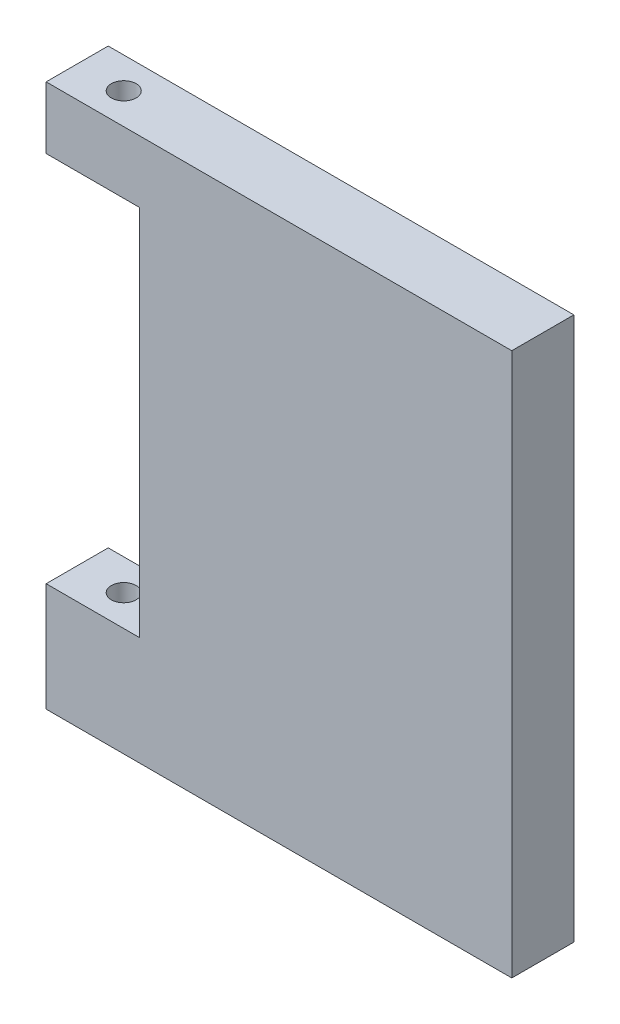
ISO-10303-21;
HEADER;
FILE_DESCRIPTION(('STEP AP214'),'2;1');
FILE_NAME('part.step','',(''),(''),'','','');
FILE_SCHEMA(('AUTOMOTIVE_DESIGN { 1 0 10303 214 1 1 1 1 }'));
ENDSEC;
DATA;
#1=APPLICATION_CONTEXT('core data for automotive mechanical design processes');
#2=APPLICATION_PROTOCOL_DEFINITION('international standard','automotive_design',2000,#1);
#3=PRODUCT_CONTEXT('',#1,'mechanical');
#4=PRODUCT('Part','Part','',(#3));
#5=PRODUCT_RELATED_PRODUCT_CATEGORY('part','',(#4));
#6=PRODUCT_DEFINITION_FORMATION('','',#4);
#7=PRODUCT_DEFINITION_CONTEXT('part definition',#1,'design');
#8=PRODUCT_DEFINITION('design','',#6,#7);
#9=PRODUCT_DEFINITION_SHAPE('','',#8);
#10=(LENGTH_UNIT() NAMED_UNIT(*) SI_UNIT(.MILLI.,.METRE.));
#11=(NAMED_UNIT(*) PLANE_ANGLE_UNIT() SI_UNIT($,.RADIAN.));
#12=(NAMED_UNIT(*) SI_UNIT($,.STERADIAN.) SOLID_ANGLE_UNIT());
#13=UNCERTAINTY_MEASURE_WITH_UNIT(LENGTH_MEASURE(1.E-05),#10,'distance_accuracy_value','');
#14=(GEOMETRIC_REPRESENTATION_CONTEXT(3) GLOBAL_UNCERTAINTY_ASSIGNED_CONTEXT((#13)) GLOBAL_UNIT_ASSIGNED_CONTEXT((#10,
#11,#12)) REPRESENTATION_CONTEXT('',''));
#15=CARTESIAN_POINT('',(0.,0.,0.));
#16=DIRECTION('',(0.,0.,1.));
#17=DIRECTION('',(1.,0.,0.));
#18=AXIS2_PLACEMENT_3D('',#15,#16,#17);
#19=CARTESIAN_POINT('',(0.,0.,40.));
#20=DIRECTION('',(-1.,0.,0.));
#21=DIRECTION('',(0.,0.,1.));
#22=AXIS2_PLACEMENT_3D('',#19,#20,#21);
#23=PLANE('',#22);
#24=DIRECTION('',(0.,1.,0.));
#25=VECTOR('',#24,1.);
#26=CARTESIAN_POINT('',(0.,0.,0.));
#27=LINE('',#26,#25);
#28=CARTESIAN_POINT('',(0.,0.,0.));
#29=VERTEX_POINT('',#28);
#30=CARTESIAN_POINT('',(0.,350.,0.));
#31=VERTEX_POINT('',#30);
#32=EDGE_CURVE('E132',#29,#31,#27,.T.);
#33=ORIENTED_EDGE('',*,*,#32,.T.);
#34=DIRECTION('',(0.,0.,-1.));
#35=VECTOR('',#34,1.);
#36=CARTESIAN_POINT('',(0.,350.,40.));
#37=LINE('',#36,#35);
#38=CARTESIAN_POINT('',(0.,350.,40.));
#39=VERTEX_POINT('',#38);
#40=EDGE_CURVE('E11',#39,#31,#37,.T.);
#41=ORIENTED_EDGE('',*,*,#40,.F.);
#42=DIRECTION('',(0.,1.,0.));
#43=VECTOR('',#42,1.);
#44=CARTESIAN_POINT('',(0.,0.,40.));
#45=LINE('',#44,#43);
#46=CARTESIAN_POINT('',(0.,0.,40.));
#47=VERTEX_POINT('',#46);
#48=EDGE_CURVE('E147',#47,#39,#45,.T.);
#49=ORIENTED_EDGE('',*,*,#48,.F.);
#50=DIRECTION('',(0.,0.,-1.));
#51=VECTOR('',#50,1.);
#52=CARTESIAN_POINT('',(0.,0.,40.));
#53=LINE('',#52,#51);
#54=EDGE_CURVE('E128',#47,#29,#53,.T.);
#55=ORIENTED_EDGE('',*,*,#54,.T.);
#56=EDGE_LOOP('',(#33,#41,#49,#55));
#57=FACE_BOUND('',#56,.T.);
#58=ADVANCED_FACE('F35',(#57),#23,.F.);
#59=CARTESIAN_POINT('',(0.,350.,40.));
#60=DIRECTION('',(0.,-1.,0.));
#61=DIRECTION('',(1.,0.,0.));
#62=AXIS2_PLACEMENT_3D('',#59,#60,#61);
#63=PLANE('',#62);
#64=CARTESIAN_POINT('',(-270.,350.,20.));
#65=DIRECTION('',(0.,1.,0.));
#66=DIRECTION('',(-1.,0.,0.));
#67=AXIS2_PLACEMENT_3D('',#64,#65,#66);
#68=CIRCLE('',#67,7.99999999999998);
#69=CARTESIAN_POINT('',(-278.,350.,20.));
#70=VERTEX_POINT('',#69);
#71=EDGE_CURVE('E183',#70,#70,#68,.T.);
#72=ORIENTED_EDGE('',*,*,#71,.F.);
#73=EDGE_LOOP('',(#72));
#74=FACE_BOUND('',#73,.T.);
#75=DIRECTION('',(-1.,0.,0.));
#76=VECTOR('',#75,1.);
#77=CARTESIAN_POINT('',(0.,350.,0.));
#78=LINE('',#77,#76);
#79=CARTESIAN_POINT('',(-300.,350.,0.));
#80=VERTEX_POINT('',#79);
#81=EDGE_CURVE('E135',#31,#80,#78,.T.);
#82=ORIENTED_EDGE('',*,*,#81,.T.);
#83=DIRECTION('',(0.,0.,-1.));
#84=VECTOR('',#83,1.);
#85=CARTESIAN_POINT('',(-300.,350.,40.));
#86=LINE('',#85,#84);
#87=CARTESIAN_POINT('',(-300.,350.,40.));
#88=VERTEX_POINT('',#87);
#89=EDGE_CURVE('E44',#88,#80,#86,.T.);
#90=ORIENTED_EDGE('',*,*,#89,.F.);
#91=DIRECTION('',(-1.,0.,0.));
#92=VECTOR('',#91,1.);
#93=CARTESIAN_POINT('',(0.,350.,40.));
#94=LINE('',#93,#92);
#95=EDGE_CURVE('E95',#39,#88,#94,.T.);
#96=ORIENTED_EDGE('',*,*,#95,.F.);
#97=ORIENTED_EDGE('',*,*,#40,.T.);
#98=EDGE_LOOP('',(#82,#90,#96,#97));
#99=FACE_BOUND('',#98,.T.);
#100=ADVANCED_FACE('F244',(#74,#99),#63,.F.);
#101=CARTESIAN_POINT('',(-300.,310.,40.));
#102=DIRECTION('',(1.,0.,0.));
#103=DIRECTION('',(0.,0.,-1.));
#104=AXIS2_PLACEMENT_3D('',#101,#102,#103);
#105=PLANE('',#104);
#106=DIRECTION('',(0.,-1.,0.));
#107=VECTOR('',#106,1.);
#108=CARTESIAN_POINT('',(-300.,310.,0.));
#109=LINE('',#108,#107);
#110=CARTESIAN_POINT('',(-300.,310.,0.));
#111=VERTEX_POINT('',#110);
#112=EDGE_CURVE('E138',#80,#111,#109,.T.);
#113=ORIENTED_EDGE('',*,*,#112,.T.);
#114=DIRECTION('',(0.,0.,-1.));
#115=VECTOR('',#114,1.);
#116=CARTESIAN_POINT('',(-300.,310.,40.));
#117=LINE('',#116,#115);
#118=CARTESIAN_POINT('',(-300.,310.,40.));
#119=VERTEX_POINT('',#118);
#120=EDGE_CURVE('E154',#119,#111,#117,.T.);
#121=ORIENTED_EDGE('',*,*,#120,.F.);
#122=DIRECTION('',(0.,-1.,0.));
#123=VECTOR('',#122,1.);
#124=CARTESIAN_POINT('',(-300.,310.,40.));
#125=LINE('',#124,#123);
#126=EDGE_CURVE('E163',#88,#119,#125,.T.);
#127=ORIENTED_EDGE('',*,*,#126,.F.);
#128=ORIENTED_EDGE('',*,*,#89,.T.);
#129=EDGE_LOOP('',(#113,#121,#127,#128));
#130=FACE_BOUND('',#129,.T.);
#131=ADVANCED_FACE('F161',(#130),#105,.F.);
#132=CARTESIAN_POINT('',(-300.,310.,40.));
#133=DIRECTION('',(0.,1.,0.));
#134=DIRECTION('',(-1.,0.,0.));
#135=AXIS2_PLACEMENT_3D('',#132,#133,#134);
#136=PLANE('',#135);
#137=CARTESIAN_POINT('',(-270.,310.,20.));
#138=DIRECTION('',(0.,1.,0.));
#139=DIRECTION('',(-1.,0.,0.));
#140=AXIS2_PLACEMENT_3D('',#137,#138,#139);
#141=CIRCLE('',#140,7.99999999999998);
#142=CARTESIAN_POINT('',(-278.,310.,20.));
#143=VERTEX_POINT('',#142);
#144=EDGE_CURVE('E136',#143,#143,#141,.T.);
#145=ORIENTED_EDGE('',*,*,#144,.T.);
#146=EDGE_LOOP('',(#145));
#147=FACE_BOUND('',#146,.T.);
#148=DIRECTION('',(1.,0.,0.));
#149=VECTOR('',#148,1.);
#150=CARTESIAN_POINT('',(-300.,310.,0.));
#151=LINE('',#150,#149);
#152=CARTESIAN_POINT('',(-240.,310.,0.));
#153=VERTEX_POINT('',#152);
#154=EDGE_CURVE('E140',#111,#153,#151,.T.);
#155=ORIENTED_EDGE('',*,*,#154,.T.);
#156=DIRECTION('',(0.,0.,-1.));
#157=VECTOR('',#156,1.);
#158=CARTESIAN_POINT('',(-240.,310.,40.));
#159=LINE('',#158,#157);
#160=CARTESIAN_POINT('',(-240.,310.,40.));
#161=VERTEX_POINT('',#160);
#162=EDGE_CURVE('E151',#161,#153,#159,.T.);
#163=ORIENTED_EDGE('',*,*,#162,.F.);
#164=DIRECTION('',(1.,0.,0.));
#165=VECTOR('',#164,1.);
#166=CARTESIAN_POINT('',(-300.,310.,40.));
#167=LINE('',#166,#165);
#168=EDGE_CURVE('E175',#119,#161,#167,.T.);
#169=ORIENTED_EDGE('',*,*,#168,.F.);
#170=ORIENTED_EDGE('',*,*,#120,.T.);
#171=EDGE_LOOP('',(#155,#163,#169,#170));
#172=FACE_BOUND('',#171,.T.);
#173=ADVANCED_FACE('F171',(#147,#172),#136,.F.);
#174=CARTESIAN_POINT('',(-240.,310.,40.));
#175=DIRECTION('',(1.,0.,0.));
#176=DIRECTION('',(0.,1.,0.));
#177=AXIS2_PLACEMENT_3D('',#174,#175,#176);
#178=PLANE('',#177);
#179=DIRECTION('',(0.,-1.,0.));
#180=VECTOR('',#179,1.);
#181=CARTESIAN_POINT('',(-240.,310.,0.));
#182=LINE('',#181,#180);
#183=CARTESIAN_POINT('',(-240.,70.,0.));
#184=VERTEX_POINT('',#183);
#185=EDGE_CURVE('E142',#153,#184,#182,.T.);
#186=ORIENTED_EDGE('',*,*,#185,.T.);
#187=DIRECTION('',(0.,0.,-1.));
#188=VECTOR('',#187,1.);
#189=CARTESIAN_POINT('',(-240.,70.,40.));
#190=LINE('',#189,#188);
#191=CARTESIAN_POINT('',(-240.,70.,40.));
#192=VERTEX_POINT('',#191);
#193=EDGE_CURVE('E123',#192,#184,#190,.T.);
#194=ORIENTED_EDGE('',*,*,#193,.F.);
#195=DIRECTION('',(0.,-1.,0.));
#196=VECTOR('',#195,1.);
#197=CARTESIAN_POINT('',(-240.,310.,40.));
#198=LINE('',#197,#196);
#199=EDGE_CURVE('E114',#161,#192,#198,.T.);
#200=ORIENTED_EDGE('',*,*,#199,.F.);
#201=ORIENTED_EDGE('',*,*,#162,.T.);
#202=EDGE_LOOP('',(#186,#194,#200,#201));
#203=FACE_BOUND('',#202,.T.);
#204=ADVANCED_FACE('F174',(#203),#178,.F.);
#205=CARTESIAN_POINT('',(-300.,70.,40.));
#206=DIRECTION('',(0.,-1.,0.));
#207=DIRECTION('',(0.,0.,-1.));
#208=AXIS2_PLACEMENT_3D('',#205,#206,#207);
#209=PLANE('',#208);
#210=CARTESIAN_POINT('',(-270.,70.,20.));
#211=DIRECTION('',(0.,-1.,0.));
#212=DIRECTION('',(0.,0.,-1.));
#213=AXIS2_PLACEMENT_3D('',#210,#211,#212);
#214=CIRCLE('',#213,7.99999999999998);
#215=CARTESIAN_POINT('',(-270.,70.,12.));
#216=VERTEX_POINT('',#215);
#217=EDGE_CURVE('E38',#216,#216,#214,.T.);
#218=ORIENTED_EDGE('',*,*,#217,.T.);
#219=EDGE_LOOP('',(#218));
#220=FACE_BOUND('',#219,.T.);
#221=DIRECTION('',(-1.,0.,0.));
#222=VECTOR('',#221,1.);
#223=CARTESIAN_POINT('',(-300.,70.,0.));
#224=LINE('',#223,#222);
#225=CARTESIAN_POINT('',(-300.,70.,0.));
#226=VERTEX_POINT('',#225);
#227=EDGE_CURVE('E122',#184,#226,#224,.T.);
#228=ORIENTED_EDGE('',*,*,#227,.T.);
#229=DIRECTION('',(0.,0.,-1.));
#230=VECTOR('',#229,1.);
#231=CARTESIAN_POINT('',(-300.,70.,40.));
#232=LINE('',#231,#230);
#233=CARTESIAN_POINT('',(-300.,70.,40.));
#234=VERTEX_POINT('',#233);
#235=EDGE_CURVE('E119',#234,#226,#232,.T.);
#236=ORIENTED_EDGE('',*,*,#235,.F.);
#237=DIRECTION('',(-1.,0.,0.));
#238=VECTOR('',#237,1.);
#239=CARTESIAN_POINT('',(-300.,70.,40.));
#240=LINE('',#239,#238);
#241=EDGE_CURVE('E108',#192,#234,#240,.T.);
#242=ORIENTED_EDGE('',*,*,#241,.F.);
#243=ORIENTED_EDGE('',*,*,#193,.T.);
#244=EDGE_LOOP('',(#228,#236,#242,#243));
#245=FACE_BOUND('',#244,.T.);
#246=ADVANCED_FACE('F120',(#220,#245),#209,.F.);
#247=CARTESIAN_POINT('',(-300.,0.,40.));
#248=DIRECTION('',(1.,0.,0.));
#249=DIRECTION('',(0.,0.,-1.));
#250=AXIS2_PLACEMENT_3D('',#247,#248,#249);
#251=PLANE('',#250);
#252=DIRECTION('',(0.,-1.,0.));
#253=VECTOR('',#252,1.);
#254=CARTESIAN_POINT('',(-300.,0.,0.));
#255=LINE('',#254,#253);
#256=CARTESIAN_POINT('',(-300.,0.,0.));
#257=VERTEX_POINT('',#256);
#258=EDGE_CURVE('E81',#226,#257,#255,.T.);
#259=ORIENTED_EDGE('',*,*,#258,.T.);
#260=DIRECTION('',(0.,0.,-1.));
#261=VECTOR('',#260,1.);
#262=CARTESIAN_POINT('',(-300.,0.,40.));
#263=LINE('',#262,#261);
#264=CARTESIAN_POINT('',(-300.,0.,40.));
#265=VERTEX_POINT('',#264);
#266=EDGE_CURVE('E124',#265,#257,#263,.T.);
#267=ORIENTED_EDGE('',*,*,#266,.F.);
#268=DIRECTION('',(0.,-1.,0.));
#269=VECTOR('',#268,1.);
#270=CARTESIAN_POINT('',(-300.,0.,40.));
#271=LINE('',#270,#269);
#272=EDGE_CURVE('E112',#234,#265,#271,.T.);
#273=ORIENTED_EDGE('',*,*,#272,.F.);
#274=ORIENTED_EDGE('',*,*,#235,.T.);
#275=EDGE_LOOP('',(#259,#267,#273,#274));
#276=FACE_BOUND('',#275,.T.);
#277=ADVANCED_FACE('F126',(#276),#251,.F.);
#278=CARTESIAN_POINT('',(0.,0.,40.));
#279=DIRECTION('',(0.,1.,0.));
#280=DIRECTION('',(0.,0.,1.));
#281=AXIS2_PLACEMENT_3D('',#278,#279,#280);
#282=PLANE('',#281);
#283=CARTESIAN_POINT('',(-210.,0.,20.));
#284=DIRECTION('',(0.,-1.,0.));
#285=DIRECTION('',(0.,0.,-1.));
#286=AXIS2_PLACEMENT_3D('',#283,#284,#285);
#287=CIRCLE('',#286,3.99999999999999);
#288=CARTESIAN_POINT('',(-210.,0.,16.));
#289=VERTEX_POINT('',#288);
#290=EDGE_CURVE('E202',#289,#289,#287,.T.);
#291=ORIENTED_EDGE('',*,*,#290,.F.);
#292=EDGE_LOOP('',(#291));
#293=FACE_BOUND('',#292,.T.);
#294=CARTESIAN_POINT('',(-120.,0.,20.));
#295=DIRECTION('',(0.,-1.,0.));
#296=DIRECTION('',(0.,0.,-1.));
#297=AXIS2_PLACEMENT_3D('',#294,#295,#296);
#298=CIRCLE('',#297,4.00000000000001);
#299=CARTESIAN_POINT('',(-120.,0.,16.));
#300=VERTEX_POINT('',#299);
#301=EDGE_CURVE('E196',#300,#300,#298,.T.);
#302=ORIENTED_EDGE('',*,*,#301,.F.);
#303=EDGE_LOOP('',(#302));
#304=FACE_BOUND('',#303,.T.);
#305=CARTESIAN_POINT('',(-30.,0.,20.));
#306=DIRECTION('',(0.,-1.,0.));
#307=DIRECTION('',(0.,0.,-1.));
#308=AXIS2_PLACEMENT_3D('',#305,#306,#307);
#309=CIRCLE('',#308,4.00000000000001);
#310=CARTESIAN_POINT('',(-30.,0.,16.));
#311=VERTEX_POINT('',#310);
#312=EDGE_CURVE('E190',#311,#311,#309,.T.);
#313=ORIENTED_EDGE('',*,*,#312,.F.);
#314=EDGE_LOOP('',(#313));
#315=FACE_BOUND('',#314,.T.);
#316=DIRECTION('',(1.,0.,0.));
#317=VECTOR('',#316,1.);
#318=CARTESIAN_POINT('',(0.,0.,0.));
#319=LINE('',#318,#317);
#320=EDGE_CURVE('E87',#257,#29,#319,.T.);
#321=ORIENTED_EDGE('',*,*,#320,.T.);
#322=ORIENTED_EDGE('',*,*,#54,.F.);
#323=DIRECTION('',(1.,0.,0.));
#324=VECTOR('',#323,1.);
#325=CARTESIAN_POINT('',(0.,0.,40.));
#326=LINE('',#325,#324);
#327=EDGE_CURVE('E52',#265,#47,#326,.T.);
#328=ORIENTED_EDGE('',*,*,#327,.F.);
#329=ORIENTED_EDGE('',*,*,#266,.T.);
#330=EDGE_LOOP('',(#321,#322,#328,#329));
#331=FACE_BOUND('',#330,.T.);
#332=ADVANCED_FACE('F217',(#293,#304,#315,#331),#282,.F.);
#333=CARTESIAN_POINT('',(0.,0.,40.));
#334=DIRECTION('',(0.,0.,1.));
#335=DIRECTION('',(1.,0.,0.));
#336=AXIS2_PLACEMENT_3D('',#333,#334,#335);
#337=PLANE('',#336);
#338=ORIENTED_EDGE('',*,*,#48,.T.);
#339=ORIENTED_EDGE('',*,*,#95,.T.);
#340=ORIENTED_EDGE('',*,*,#126,.T.);
#341=ORIENTED_EDGE('',*,*,#168,.T.);
#342=ORIENTED_EDGE('',*,*,#199,.T.);
#343=ORIENTED_EDGE('',*,*,#241,.T.);
#344=ORIENTED_EDGE('',*,*,#272,.T.);
#345=ORIENTED_EDGE('',*,*,#327,.T.);
#346=EDGE_LOOP('',(#338,#339,#340,#341,#342,#343,#344,#345));
#347=FACE_BOUND('',#346,.T.);
#348=ADVANCED_FACE('F110',(#347),#337,.T.);
#349=CARTESIAN_POINT('',(0.,0.,0.));
#350=DIRECTION('',(0.,0.,1.));
#351=DIRECTION('',(1.,0.,0.));
#352=AXIS2_PLACEMENT_3D('',#349,#350,#351);
#353=PLANE('',#352);
#354=ORIENTED_EDGE('',*,*,#32,.F.);
#355=ORIENTED_EDGE('',*,*,#320,.F.);
#356=ORIENTED_EDGE('',*,*,#258,.F.);
#357=ORIENTED_EDGE('',*,*,#227,.F.);
#358=ORIENTED_EDGE('',*,*,#185,.F.);
#359=ORIENTED_EDGE('',*,*,#154,.F.);
#360=ORIENTED_EDGE('',*,*,#112,.F.);
#361=ORIENTED_EDGE('',*,*,#81,.F.);
#362=EDGE_LOOP('',(#354,#355,#356,#357,#358,#359,#360,#361));
#363=FACE_BOUND('',#362,.T.);
#364=ADVANCED_FACE('F167',(#363),#353,.F.);
#365=CARTESIAN_POINT('',(-270.,49.9999999999998,20.));
#366=DIRECTION('',(0.,1.,0.));
#367=DIRECTION('',(-1.,0.,0.));
#368=AXIS2_PLACEMENT_3D('',#365,#366,#367);
#369=PLANE('',#368);
#370=CARTESIAN_POINT('',(-270.,49.9999999999998,20.));
#371=DIRECTION('',(0.,1.,0.));
#372=DIRECTION('',(-1.,0.,0.));
#373=AXIS2_PLACEMENT_3D('',#370,#371,#372);
#374=CIRCLE('',#373,7.99999999999998);
#375=CARTESIAN_POINT('',(-278.,49.9999999999998,20.));
#376=VERTEX_POINT('',#375);
#377=EDGE_CURVE('E186',#376,#376,#374,.T.);
#378=ORIENTED_EDGE('',*,*,#377,.T.);
#379=EDGE_LOOP('',(#378));
#380=FACE_BOUND('',#379,.T.);
#381=ADVANCED_FACE('F270',(#380),#369,.T.);
#382=CARTESIAN_POINT('',(-270.,49.9999999999998,20.));
#383=DIRECTION('',(0.,1.,0.));
#384=DIRECTION('',(-1.,0.,0.));
#385=AXIS2_PLACEMENT_3D('',#382,#383,#384);
#386=CYLINDRICAL_SURFACE('',#385,7.99999999999998);
#387=ORIENTED_EDGE('',*,*,#377,.F.);
#388=EDGE_LOOP('',(#387));
#389=FACE_BOUND('',#388,.T.);
#390=ORIENTED_EDGE('',*,*,#217,.F.);
#391=EDGE_LOOP('',(#390));
#392=FACE_BOUND('',#391,.T.);
#393=ADVANCED_FACE('F238',(#389,#392),#386,.F.);
#394=ORIENTED_EDGE('',*,*,#71,.T.);
#395=EDGE_LOOP('',(#394));
#396=FACE_BOUND('',#395,.T.);
#397=ORIENTED_EDGE('',*,*,#144,.F.);
#398=EDGE_LOOP('',(#397));
#399=FACE_BOUND('',#398,.T.);
#400=ADVANCED_FACE('F228',(#396,#399),#386,.F.);
#401=CARTESIAN_POINT('',(-30.,50.,20.));
#402=DIRECTION('',(0.,-1.,0.));
#403=DIRECTION('',(0.,0.,-1.));
#404=AXIS2_PLACEMENT_3D('',#401,#402,#403);
#405=CYLINDRICAL_SURFACE('',#404,4.00000000000001);
#406=CARTESIAN_POINT('',(-30.,50.,20.));
#407=DIRECTION('',(0.,-1.,0.));
#408=DIRECTION('',(0.,0.,-1.));
#409=AXIS2_PLACEMENT_3D('',#406,#407,#408);
#410=CIRCLE('',#409,4.00000000000001);
#411=CARTESIAN_POINT('',(-30.,50.,16.));
#412=VERTEX_POINT('',#411);
#413=EDGE_CURVE('E187',#412,#412,#410,.T.);
#414=ORIENTED_EDGE('',*,*,#413,.F.);
#415=EDGE_LOOP('',(#414));
#416=FACE_BOUND('',#415,.T.);
#417=ORIENTED_EDGE('',*,*,#312,.T.);
#418=EDGE_LOOP('',(#417));
#419=FACE_BOUND('',#418,.T.);
#420=ADVANCED_FACE('F225',(#416,#419),#405,.F.);
#421=CARTESIAN_POINT('',(-30.,50.,20.));
#422=DIRECTION('',(0.,-1.,0.));
#423=DIRECTION('',(0.,0.,-1.));
#424=AXIS2_PLACEMENT_3D('',#421,#422,#423);
#425=PLANE('',#424);
#426=ORIENTED_EDGE('',*,*,#413,.T.);
#427=EDGE_LOOP('',(#426));
#428=FACE_BOUND('',#427,.T.);
#429=ADVANCED_FACE('F227',(#428),#425,.T.);
#430=CARTESIAN_POINT('',(-120.,50.,20.));
#431=DIRECTION('',(0.,-1.,0.));
#432=DIRECTION('',(0.,0.,-1.));
#433=AXIS2_PLACEMENT_3D('',#430,#431,#432);
#434=CYLINDRICAL_SURFACE('',#433,4.00000000000001);
#435=CARTESIAN_POINT('',(-120.,50.,20.));
#436=DIRECTION('',(0.,-1.,0.));
#437=DIRECTION('',(0.,0.,-1.));
#438=AXIS2_PLACEMENT_3D('',#435,#436,#437);
#439=CIRCLE('',#438,4.00000000000001);
#440=CARTESIAN_POINT('',(-120.,50.,16.));
#441=VERTEX_POINT('',#440);
#442=EDGE_CURVE('E193',#441,#441,#439,.T.);
#443=ORIENTED_EDGE('',*,*,#442,.F.);
#444=EDGE_LOOP('',(#443));
#445=FACE_BOUND('',#444,.T.);
#446=ORIENTED_EDGE('',*,*,#301,.T.);
#447=EDGE_LOOP('',(#446));
#448=FACE_BOUND('',#447,.T.);
#449=ADVANCED_FACE('F235',(#445,#448),#434,.F.);
#450=CARTESIAN_POINT('',(-120.,50.,20.));
#451=DIRECTION('',(0.,-1.,0.));
#452=DIRECTION('',(0.,0.,-1.));
#453=AXIS2_PLACEMENT_3D('',#450,#451,#452);
#454=PLANE('',#453);
#455=ORIENTED_EDGE('',*,*,#442,.T.);
#456=EDGE_LOOP('',(#455));
#457=FACE_BOUND('',#456,.T.);
#458=ADVANCED_FACE('F213',(#457),#454,.T.);
#459=CARTESIAN_POINT('',(-210.,50.,20.));
#460=DIRECTION('',(0.,-1.,0.));
#461=DIRECTION('',(0.,0.,-1.));
#462=AXIS2_PLACEMENT_3D('',#459,#460,#461);
#463=CYLINDRICAL_SURFACE('',#462,3.99999999999999);
#464=CARTESIAN_POINT('',(-210.,50.,20.));
#465=DIRECTION('',(0.,-1.,0.));
#466=DIRECTION('',(0.,0.,-1.));
#467=AXIS2_PLACEMENT_3D('',#464,#465,#466);
#468=CIRCLE('',#467,3.99999999999999);
#469=CARTESIAN_POINT('',(-210.,50.,16.));
#470=VERTEX_POINT('',#469);
#471=EDGE_CURVE('E199',#470,#470,#468,.T.);
#472=ORIENTED_EDGE('',*,*,#471,.F.);
#473=EDGE_LOOP('',(#472));
#474=FACE_BOUND('',#473,.T.);
#475=ORIENTED_EDGE('',*,*,#290,.T.);
#476=EDGE_LOOP('',(#475));
#477=FACE_BOUND('',#476,.T.);
#478=ADVANCED_FACE('F210',(#474,#477),#463,.F.);
#479=CARTESIAN_POINT('',(-210.,50.,20.));
#480=DIRECTION('',(0.,-1.,0.));
#481=DIRECTION('',(0.,0.,-1.));
#482=AXIS2_PLACEMENT_3D('',#479,#480,#481);
#483=PLANE('',#482);
#484=ORIENTED_EDGE('',*,*,#471,.T.);
#485=EDGE_LOOP('',(#484));
#486=FACE_BOUND('',#485,.T.);
#487=ADVANCED_FACE('F208',(#486),#483,.T.);
#488=CLOSED_SHELL('',(#58,#100,#131,#173,#204,#246,#277,#332,#348,#364,#381,#393,#400,#420,#429,
#449,#458,#478,#487));
#489=MANIFOLD_SOLID_BREP('B2',#488);
#490=ADVANCED_BREP_SHAPE_REPRESENTATION('',(#18,#489),#14);
#491=SHAPE_DEFINITION_REPRESENTATION(#9,#490);
ENDSEC;
END-ISO-10303-21;
